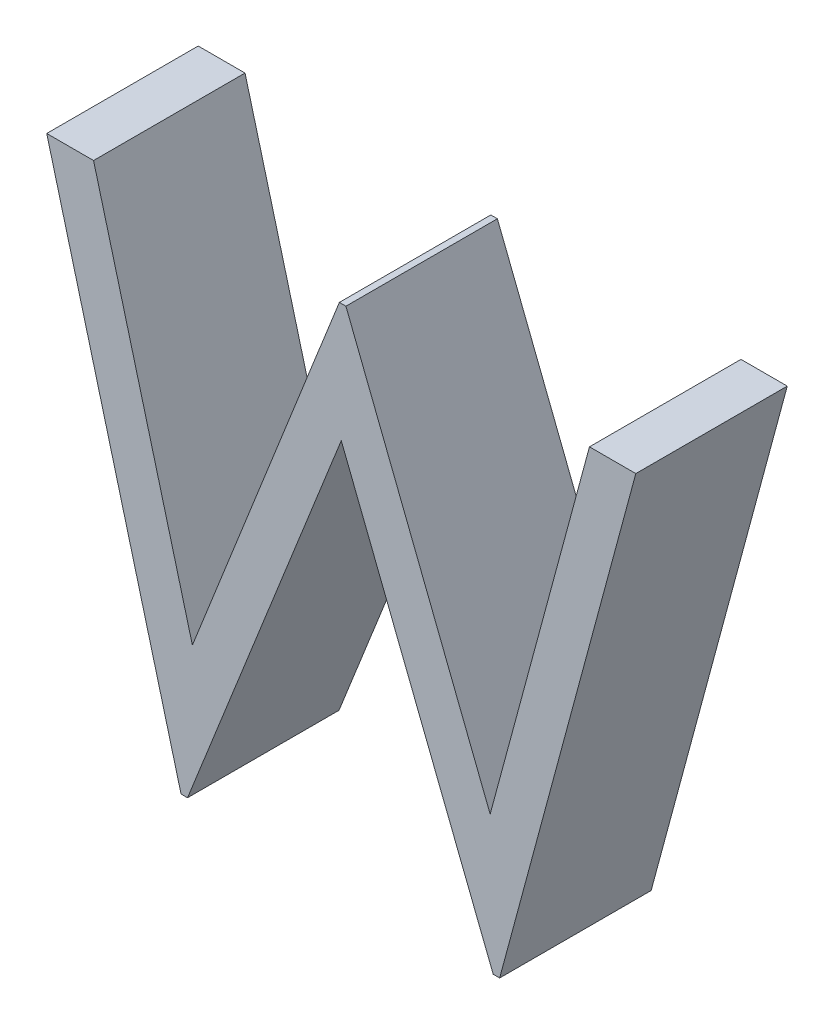
ISO-10303-21;
HEADER;
FILE_DESCRIPTION(('STEP AP214'),'2;1');
FILE_NAME('part.step','',(''),(''),'','','');
FILE_SCHEMA(('AUTOMOTIVE_DESIGN { 1 0 10303 214 1 1 1 1 }'));
ENDSEC;
DATA;
#1=APPLICATION_CONTEXT('core data for automotive mechanical design processes');
#2=APPLICATION_PROTOCOL_DEFINITION('international standard','automotive_design',2000,#1);
#3=PRODUCT_CONTEXT('',#1,'mechanical');
#4=PRODUCT('Part','Part','',(#3));
#5=PRODUCT_RELATED_PRODUCT_CATEGORY('part','',(#4));
#6=PRODUCT_DEFINITION_FORMATION('','',#4);
#7=PRODUCT_DEFINITION_CONTEXT('part definition',#1,'design');
#8=PRODUCT_DEFINITION('design','',#6,#7);
#9=PRODUCT_DEFINITION_SHAPE('','',#8);
#10=(LENGTH_UNIT() NAMED_UNIT(*) SI_UNIT(.MILLI.,.METRE.));
#11=(NAMED_UNIT(*) PLANE_ANGLE_UNIT() SI_UNIT($,.RADIAN.));
#12=(NAMED_UNIT(*) SI_UNIT($,.STERADIAN.) SOLID_ANGLE_UNIT());
#13=UNCERTAINTY_MEASURE_WITH_UNIT(LENGTH_MEASURE(1.E-05),#10,'distance_accuracy_value','');
#14=(GEOMETRIC_REPRESENTATION_CONTEXT(3) GLOBAL_UNCERTAINTY_ASSIGNED_CONTEXT((#13)) GLOBAL_UNIT_ASSIGNED_CONTEXT((#10,
#11,#12)) REPRESENTATION_CONTEXT('',''));
#15=CARTESIAN_POINT('',(0.,0.,0.));
#16=DIRECTION('',(0.,0.,1.));
#17=DIRECTION('',(1.,0.,0.));
#18=AXIS2_PLACEMENT_3D('',#15,#16,#17);
#19=CARTESIAN_POINT('',(-54.4228499412542,-22.8701190762308,1.5));
#20=DIRECTION('',(-0.966388993927676,-0.257084251589734,0.));
#21=DIRECTION('',(0.257084251589735,-0.966388993927676,0.));
#22=AXIS2_PLACEMENT_3D('',#19,#20,#21);
#23=PLANE('',#22);
#24=DIRECTION('',(-0.257084251589734,0.966388993927676,0.));
#25=VECTOR('',#24,1.);
#26=CARTESIAN_POINT('',(-54.4228499412542,-22.8701190762308,0.));
#27=LINE('',#26,#25);
#28=CARTESIAN_POINT('',(-54.4228499412542,-22.8701190762308,0.));
#29=VERTEX_POINT('',#28);
#30=CARTESIAN_POINT('',(-55.7529781463824,-17.8701190762308,0.));
#31=VERTEX_POINT('',#30);
#32=EDGE_CURVE('E160',#29,#31,#27,.T.);
#33=ORIENTED_EDGE('',*,*,#32,.F.);
#34=DIRECTION('',(0.,0.,-1.));
#35=VECTOR('',#34,1.);
#36=CARTESIAN_POINT('',(-54.4228499412542,-22.8701190762308,1.5));
#37=LINE('',#36,#35);
#38=CARTESIAN_POINT('',(-54.4228499412542,-22.8701190762308,1.5));
#39=VERTEX_POINT('',#38);
#40=EDGE_CURVE('E11',#39,#29,#37,.T.);
#41=ORIENTED_EDGE('',*,*,#40,.F.);
#42=DIRECTION('',(-0.257084251589734,0.966388993927676,0.));
#43=VECTOR('',#42,1.);
#44=CARTESIAN_POINT('',(-54.4228499412542,-22.8701190762308,1.5));
#45=LINE('',#44,#43);
#46=CARTESIAN_POINT('',(-55.7529781463824,-17.8701190762308,1.5));
#47=VERTEX_POINT('',#46);
#48=EDGE_CURVE('E195',#39,#47,#45,.T.);
#49=ORIENTED_EDGE('',*,*,#48,.T.);
#50=DIRECTION('',(0.,0.,-1.));
#51=VECTOR('',#50,1.);
#52=CARTESIAN_POINT('',(-55.7529781463824,-17.8701190762308,1.5));
#53=LINE('',#52,#51);
#54=EDGE_CURVE('E36',#47,#31,#53,.T.);
#55=ORIENTED_EDGE('',*,*,#54,.T.);
#56=EDGE_LOOP('',(#33,#41,#49,#55));
#57=FACE_BOUND('',#56,.T.);
#58=ADVANCED_FACE('F33',(#57),#23,.T.);
#59=CARTESIAN_POINT('',(-54.3587473771516,-22.8701190762308,1.5));
#60=DIRECTION('',(0.,-1.,0.));
#61=DIRECTION('',(0.,0.,-1.));
#62=AXIS2_PLACEMENT_3D('',#59,#60,#61);
#63=PLANE('',#62);
#64=DIRECTION('',(-1.,0.,0.));
#65=VECTOR('',#64,1.);
#66=CARTESIAN_POINT('',(-54.3587473771516,-22.8701190762308,0.));
#67=LINE('',#66,#65);
#68=CARTESIAN_POINT('',(-54.3587473771516,-22.8701190762308,0.));
#69=VERTEX_POINT('',#68);
#70=EDGE_CURVE('E193',#69,#29,#67,.T.);
#71=ORIENTED_EDGE('',*,*,#70,.F.);
#72=DIRECTION('',(0.,0.,-1.));
#73=VECTOR('',#72,1.);
#74=CARTESIAN_POINT('',(-54.3587473771516,-22.8701190762308,1.5));
#75=LINE('',#74,#73);
#76=CARTESIAN_POINT('',(-54.3587473771516,-22.8701190762308,1.5));
#77=VERTEX_POINT('',#76);
#78=EDGE_CURVE('E42',#77,#69,#75,.T.);
#79=ORIENTED_EDGE('',*,*,#78,.F.);
#80=DIRECTION('',(-1.,0.,0.));
#81=VECTOR('',#80,1.);
#82=CARTESIAN_POINT('',(-54.3587473771516,-22.8701190762308,1.5));
#83=LINE('',#82,#81);
#84=EDGE_CURVE('E150',#77,#39,#83,.T.);
#85=ORIENTED_EDGE('',*,*,#84,.T.);
#86=ORIENTED_EDGE('',*,*,#40,.T.);
#87=EDGE_LOOP('',(#71,#79,#85,#86));
#88=FACE_BOUND('',#87,.T.);
#89=ADVANCED_FACE('F217',(#88),#63,.T.);
#90=CARTESIAN_POINT('',(-52.8363114797157,-19.0460004864872,1.5));
#91=DIRECTION('',(0.929079621725965,-0.369879786543599,0.));
#92=DIRECTION('',(0.369879786543599,0.929079621725965,0.));
#93=AXIS2_PLACEMENT_3D('',#90,#91,#92);
#94=PLANE('',#93);
#95=DIRECTION('',(-0.369879786543599,-0.929079621725965,0.));
#96=VECTOR('',#95,1.);
#97=CARTESIAN_POINT('',(-52.8363114797157,-19.0460004864872,0.));
#98=LINE('',#97,#96);
#99=CARTESIAN_POINT('',(-52.8363114797157,-19.0460004864872,0.));
#100=VERTEX_POINT('',#99);
#101=EDGE_CURVE('E137',#100,#69,#98,.T.);
#102=ORIENTED_EDGE('',*,*,#101,.F.);
#103=DIRECTION('',(0.,0.,-1.));
#104=VECTOR('',#103,1.);
#105=CARTESIAN_POINT('',(-52.8363114797157,-19.0460004864872,1.5));
#106=LINE('',#105,#104);
#107=CARTESIAN_POINT('',(-52.8363114797157,-19.0460004864872,1.5));
#108=VERTEX_POINT('',#107);
#109=EDGE_CURVE('E132',#108,#100,#106,.T.);
#110=ORIENTED_EDGE('',*,*,#109,.F.);
#111=DIRECTION('',(-0.369879786543599,-0.929079621725965,0.));
#112=VECTOR('',#111,1.);
#113=CARTESIAN_POINT('',(-52.8363114797157,-19.0460004864872,1.5));
#114=LINE('',#113,#112);
#115=EDGE_CURVE('E135',#108,#77,#114,.T.);
#116=ORIENTED_EDGE('',*,*,#115,.T.);
#117=ORIENTED_EDGE('',*,*,#78,.T.);
#118=EDGE_LOOP('',(#102,#110,#116,#117));
#119=FACE_BOUND('',#118,.T.);
#120=ADVANCED_FACE('F134',(#119),#94,.T.);
#121=CARTESIAN_POINT('',(-51.3319044284336,-22.8701190762308,1.5));
#122=DIRECTION('',(-0.930579564355999,-0.36608970813586,0.));
#123=DIRECTION('',(0.36608970813586,-0.930579564355999,0.));
#124=AXIS2_PLACEMENT_3D('',#121,#122,#123);
#125=PLANE('',#124);
#126=DIRECTION('',(-0.36608970813586,0.930579564355999,0.));
#127=VECTOR('',#126,1.);
#128=CARTESIAN_POINT('',(-51.3319044284336,-22.8701190762308,0.));
#129=LINE('',#128,#127);
#130=CARTESIAN_POINT('',(-51.3319044284336,-22.8701190762308,0.));
#131=VERTEX_POINT('',#130);
#132=EDGE_CURVE('E190',#131,#100,#129,.T.);
#133=ORIENTED_EDGE('',*,*,#132,.F.);
#134=DIRECTION('',(0.,0.,-1.));
#135=VECTOR('',#134,1.);
#136=CARTESIAN_POINT('',(-51.3319044284336,-22.8701190762308,1.5));
#137=LINE('',#136,#135);
#138=CARTESIAN_POINT('',(-51.3319044284336,-22.8701190762308,1.5));
#139=VERTEX_POINT('',#138);
#140=EDGE_CURVE('E142',#139,#131,#137,.T.);
#141=ORIENTED_EDGE('',*,*,#140,.F.);
#142=DIRECTION('',(-0.36608970813586,0.930579564355999,0.));
#143=VECTOR('',#142,1.);
#144=CARTESIAN_POINT('',(-51.3319044284336,-22.8701190762308,1.5));
#145=LINE('',#144,#143);
#146=EDGE_CURVE('E148',#139,#108,#145,.T.);
#147=ORIENTED_EDGE('',*,*,#146,.T.);
#148=ORIENTED_EDGE('',*,*,#109,.T.);
#149=EDGE_LOOP('',(#133,#141,#147,#148));
#150=FACE_BOUND('',#149,.T.);
#151=ADVANCED_FACE('F152',(#150),#125,.T.);
#152=CARTESIAN_POINT('',(-51.2678018643311,-22.8701190762308,1.5));
#153=DIRECTION('',(0.,-1.,0.));
#154=DIRECTION('',(0.,0.,-1.));
#155=AXIS2_PLACEMENT_3D('',#152,#153,#154);
#156=PLANE('',#155);
#157=DIRECTION('',(-1.,0.,0.));
#158=VECTOR('',#157,1.);
#159=CARTESIAN_POINT('',(-51.2678018643311,-22.8701190762308,0.));
#160=LINE('',#159,#158);
#161=CARTESIAN_POINT('',(-51.2678018643311,-22.8701190762308,0.));
#162=VERTEX_POINT('',#161);
#163=EDGE_CURVE('E187',#162,#131,#160,.T.);
#164=ORIENTED_EDGE('',*,*,#163,.F.);
#165=DIRECTION('',(0.,0.,-1.));
#166=VECTOR('',#165,1.);
#167=CARTESIAN_POINT('',(-51.2678018643311,-22.8701190762308,1.5));
#168=LINE('',#167,#166);
#169=CARTESIAN_POINT('',(-51.2678018643311,-22.8701190762308,1.5));
#170=VERTEX_POINT('',#169);
#171=EDGE_CURVE('E199',#170,#162,#168,.T.);
#172=ORIENTED_EDGE('',*,*,#171,.F.);
#173=DIRECTION('',(-1.,0.,0.));
#174=VECTOR('',#173,1.);
#175=CARTESIAN_POINT('',(-51.2678018643311,-22.8701190762308,1.5));
#176=LINE('',#175,#174);
#177=EDGE_CURVE('E153',#170,#139,#176,.T.);
#178=ORIENTED_EDGE('',*,*,#177,.T.);
#179=ORIENTED_EDGE('',*,*,#140,.T.);
#180=EDGE_LOOP('',(#164,#172,#178,#179));
#181=FACE_BOUND('',#180,.T.);
#182=ADVANCED_FACE('F230',(#181),#156,.T.);
#183=CARTESIAN_POINT('',(-49.919644813049,-17.8701190762308,1.5));
#184=DIRECTION('',(0.965518584404461,-0.260334137541748,0.));
#185=DIRECTION('',(0.260334137541748,0.965518584404461,0.));
#186=AXIS2_PLACEMENT_3D('',#183,#184,#185);
#187=PLANE('',#186);
#188=DIRECTION('',(-0.260334137541748,-0.965518584404461,0.));
#189=VECTOR('',#188,1.);
#190=CARTESIAN_POINT('',(-49.919644813049,-17.8701190762308,0.));
#191=LINE('',#190,#189);
#192=CARTESIAN_POINT('',(-49.919644813049,-17.8701190762308,0.));
#193=VERTEX_POINT('',#192);
#194=EDGE_CURVE('E184',#193,#162,#191,.T.);
#195=ORIENTED_EDGE('',*,*,#194,.F.);
#196=DIRECTION('',(0.,0.,-1.));
#197=VECTOR('',#196,1.);
#198=CARTESIAN_POINT('',(-49.919644813049,-17.8701190762308,1.5));
#199=LINE('',#198,#197);
#200=CARTESIAN_POINT('',(-49.919644813049,-17.8701190762308,1.5));
#201=VERTEX_POINT('',#200);
#202=EDGE_CURVE('E201',#201,#193,#199,.T.);
#203=ORIENTED_EDGE('',*,*,#202,.F.);
#204=DIRECTION('',(-0.260334137541748,-0.965518584404461,0.));
#205=VECTOR('',#204,1.);
#206=CARTESIAN_POINT('',(-49.919644813049,-17.8701190762308,1.5));
#207=LINE('',#206,#205);
#208=EDGE_CURVE('E155',#201,#170,#207,.T.);
#209=ORIENTED_EDGE('',*,*,#208,.T.);
#210=ORIENTED_EDGE('',*,*,#171,.T.);
#211=EDGE_LOOP('',(#195,#203,#209,#210));
#212=FACE_BOUND('',#211,.T.);
#213=ADVANCED_FACE('F233',(#212),#187,.T.);
#214=CARTESIAN_POINT('',(-50.378378787408,-17.8701190762308,1.5));
#215=DIRECTION('',(0.,1.,0.));
#216=DIRECTION('',(0.,0.,1.));
#217=AXIS2_PLACEMENT_3D('',#214,#215,#216);
#218=PLANE('',#217);
#219=DIRECTION('',(1.,0.,0.));
#220=VECTOR('',#219,1.);
#221=CARTESIAN_POINT('',(-50.378378787408,-17.8701190762308,0.));
#222=LINE('',#221,#220);
#223=CARTESIAN_POINT('',(-50.378378787408,-17.8701190762308,0.));
#224=VERTEX_POINT('',#223);
#225=EDGE_CURVE('E181',#224,#193,#222,.T.);
#226=ORIENTED_EDGE('',*,*,#225,.F.);
#227=DIRECTION('',(0.,0.,-1.));
#228=VECTOR('',#227,1.);
#229=CARTESIAN_POINT('',(-50.378378787408,-17.8701190762308,1.5));
#230=LINE('',#229,#228);
#231=CARTESIAN_POINT('',(-50.378378787408,-17.8701190762308,1.5));
#232=VERTEX_POINT('',#231);
#233=EDGE_CURVE('E203',#232,#224,#230,.T.);
#234=ORIENTED_EDGE('',*,*,#233,.F.);
#235=DIRECTION('',(1.,0.,0.));
#236=VECTOR('',#235,1.);
#237=CARTESIAN_POINT('',(-50.378378787408,-17.8701190762308,1.5));
#238=LINE('',#237,#236);
#239=EDGE_CURVE('E409',#232,#201,#238,.T.);
#240=ORIENTED_EDGE('',*,*,#239,.T.);
#241=ORIENTED_EDGE('',*,*,#202,.T.);
#242=EDGE_LOOP('',(#226,#234,#240,#241));
#243=FACE_BOUND('',#242,.T.);
#244=ADVANCED_FACE('F237',(#243),#218,.T.);
#245=CARTESIAN_POINT('',(-51.3619525053567,-21.5119459993077,1.5));
#246=DIRECTION('',(-0.965410371069075,0.260735144221625,0.));
#247=DIRECTION('',(-0.260735144221625,-0.965410371069075,0.));
#248=AXIS2_PLACEMENT_3D('',#245,#246,#247);
#249=PLANE('',#248);
#250=DIRECTION('',(0.260735144221625,0.965410371069074,0.));
#251=VECTOR('',#250,1.);
#252=CARTESIAN_POINT('',(-51.3619525053567,-21.5119459993077,0.));
#253=LINE('',#252,#251);
#254=CARTESIAN_POINT('',(-51.3619525053567,-21.5119459993077,0.));
#255=VERTEX_POINT('',#254);
#256=EDGE_CURVE('E178',#255,#224,#253,.T.);
#257=ORIENTED_EDGE('',*,*,#256,.F.);
#258=DIRECTION('',(0.,0.,-1.));
#259=VECTOR('',#258,1.);
#260=CARTESIAN_POINT('',(-51.3619525053567,-21.5119459993077,1.5));
#261=LINE('',#260,#259);
#262=CARTESIAN_POINT('',(-51.3619525053567,-21.5119459993077,1.5));
#263=VERTEX_POINT('',#262);
#264=EDGE_CURVE('E205',#263,#255,#261,.T.);
#265=ORIENTED_EDGE('',*,*,#264,.F.);
#266=DIRECTION('',(0.260735144221625,0.965410371069074,0.));
#267=VECTOR('',#266,1.);
#268=CARTESIAN_POINT('',(-51.3619525053567,-21.5119459993077,1.5));
#269=LINE('',#268,#267);
#270=EDGE_CURVE('E405',#263,#232,#269,.T.);
#271=ORIENTED_EDGE('',*,*,#270,.T.);
#272=ORIENTED_EDGE('',*,*,#233,.T.);
#273=EDGE_LOOP('',(#257,#265,#271,#272));
#274=FACE_BOUND('',#273,.T.);
#275=ADVANCED_FACE('F241',(#274),#249,.T.);
#276=CARTESIAN_POINT('',(-52.790237761767,-17.8701190762308,1.5));
#277=DIRECTION('',(0.93096295991701,0.365113636095065,0.));
#278=DIRECTION('',(-0.365113636095065,0.93096295991701,0.));
#279=AXIS2_PLACEMENT_3D('',#276,#277,#278);
#280=PLANE('',#279);
#281=DIRECTION('',(0.365113636095065,-0.93096295991701,0.));
#282=VECTOR('',#281,1.);
#283=CARTESIAN_POINT('',(-52.790237761767,-17.8701190762308,0.));
#284=LINE('',#283,#282);
#285=CARTESIAN_POINT('',(-52.790237761767,-17.8701190762308,0.));
#286=VERTEX_POINT('',#285);
#287=EDGE_CURVE('E175',#286,#255,#284,.T.);
#288=ORIENTED_EDGE('',*,*,#287,.F.);
#289=DIRECTION('',(0.,0.,-1.));
#290=VECTOR('',#289,1.);
#291=CARTESIAN_POINT('',(-52.790237761767,-17.8701190762308,1.5));
#292=LINE('',#291,#290);
#293=CARTESIAN_POINT('',(-52.790237761767,-17.8701190762308,1.5));
#294=VERTEX_POINT('',#293);
#295=EDGE_CURVE('E207',#294,#286,#292,.T.);
#296=ORIENTED_EDGE('',*,*,#295,.F.);
#297=DIRECTION('',(0.365113636095065,-0.93096295991701,0.));
#298=VECTOR('',#297,1.);
#299=CARTESIAN_POINT('',(-52.790237761767,-17.8701190762308,1.5));
#300=LINE('',#299,#298);
#301=EDGE_CURVE('E416',#294,#263,#300,.T.);
#302=ORIENTED_EDGE('',*,*,#301,.T.);
#303=ORIENTED_EDGE('',*,*,#264,.T.);
#304=EDGE_LOOP('',(#288,#296,#302,#303));
#305=FACE_BOUND('',#304,.T.);
#306=ADVANCED_FACE('F245',(#305),#280,.T.);
#307=CARTESIAN_POINT('',(-52.8553419284336,-17.8701190762308,1.5));
#308=DIRECTION('',(0.,1.,0.));
#309=DIRECTION('',(0.,0.,1.));
#310=AXIS2_PLACEMENT_3D('',#307,#308,#309);
#311=PLANE('',#310);
#312=DIRECTION('',(1.,0.,0.));
#313=VECTOR('',#312,1.);
#314=CARTESIAN_POINT('',(-52.8553419284336,-17.8701190762308,0.));
#315=LINE('',#314,#313);
#316=CARTESIAN_POINT('',(-52.8553419284336,-17.8701190762308,0.));
#317=VERTEX_POINT('',#316);
#318=EDGE_CURVE('E172',#317,#286,#315,.T.);
#319=ORIENTED_EDGE('',*,*,#318,.F.);
#320=DIRECTION('',(0.,0.,-1.));
#321=VECTOR('',#320,1.);
#322=CARTESIAN_POINT('',(-52.8553419284336,-17.8701190762308,1.5));
#323=LINE('',#322,#321);
#324=CARTESIAN_POINT('',(-52.8553419284336,-17.8701190762308,1.5));
#325=VERTEX_POINT('',#324);
#326=EDGE_CURVE('E209',#325,#317,#323,.T.);
#327=ORIENTED_EDGE('',*,*,#326,.F.);
#328=DIRECTION('',(1.,0.,0.));
#329=VECTOR('',#328,1.);
#330=CARTESIAN_POINT('',(-52.8553419284336,-17.8701190762308,1.5));
#331=LINE('',#330,#329);
#332=EDGE_CURVE('E398',#325,#294,#331,.T.);
#333=ORIENTED_EDGE('',*,*,#332,.T.);
#334=ORIENTED_EDGE('',*,*,#295,.T.);
#335=EDGE_LOOP('',(#319,#327,#333,#334));
#336=FACE_BOUND('',#335,.T.);
#337=ADVANCED_FACE('F249',(#336),#311,.T.);
#338=CARTESIAN_POINT('',(-54.3106704540747,-21.5369860634103,1.5));
#339=DIRECTION('',(-0.929471367358842,0.368894262980714,0.));
#340=DIRECTION('',(-0.368894262980714,-0.929471367358842,0.));
#341=AXIS2_PLACEMENT_3D('',#338,#339,#340);
#342=PLANE('',#341);
#343=DIRECTION('',(0.368894262980714,0.929471367358842,0.));
#344=VECTOR('',#343,1.);
#345=CARTESIAN_POINT('',(-54.3106704540747,-21.5369860634103,0.));
#346=LINE('',#345,#344);
#347=CARTESIAN_POINT('',(-54.3106704540747,-21.5369860634103,0.));
#348=VERTEX_POINT('',#347);
#349=EDGE_CURVE('E169',#348,#317,#346,.T.);
#350=ORIENTED_EDGE('',*,*,#349,.F.);
#351=DIRECTION('',(0.,0.,-1.));
#352=VECTOR('',#351,1.);
#353=CARTESIAN_POINT('',(-54.3106704540747,-21.5369860634103,1.5));
#354=LINE('',#353,#352);
#355=CARTESIAN_POINT('',(-54.3106704540747,-21.5369860634103,1.5));
#356=VERTEX_POINT('',#355);
#357=EDGE_CURVE('E211',#356,#348,#354,.T.);
#358=ORIENTED_EDGE('',*,*,#357,.F.);
#359=DIRECTION('',(0.368894262980714,0.929471367358842,0.));
#360=VECTOR('',#359,1.);
#361=CARTESIAN_POINT('',(-54.3106704540747,-21.5369860634103,1.5));
#362=LINE('',#361,#360);
#363=EDGE_CURVE('E394',#356,#325,#362,.T.);
#364=ORIENTED_EDGE('',*,*,#363,.T.);
#365=ORIENTED_EDGE('',*,*,#326,.T.);
#366=EDGE_LOOP('',(#350,#358,#364,#365));
#367=FACE_BOUND('',#366,.T.);
#368=ADVANCED_FACE('F253',(#367),#342,.T.);
#369=CARTESIAN_POINT('',(-55.2892361592029,-17.8701190762308,1.5));
#370=DIRECTION('',(0.966186739358345,0.257843333611883,0.));
#371=DIRECTION('',(-0.257843333611883,0.966186739358345,0.));
#372=AXIS2_PLACEMENT_3D('',#369,#370,#371);
#373=PLANE('',#372);
#374=DIRECTION('',(0.257843333611883,-0.966186739358345,0.));
#375=VECTOR('',#374,1.);
#376=CARTESIAN_POINT('',(-55.2892361592029,-17.8701190762308,0.));
#377=LINE('',#376,#375);
#378=CARTESIAN_POINT('',(-55.2892361592029,-17.8701190762308,0.));
#379=VERTEX_POINT('',#378);
#380=EDGE_CURVE('E166',#379,#348,#377,.T.);
#381=ORIENTED_EDGE('',*,*,#380,.F.);
#382=DIRECTION('',(0.,0.,-1.));
#383=VECTOR('',#382,1.);
#384=CARTESIAN_POINT('',(-55.2892361592029,-17.8701190762308,1.5));
#385=LINE('',#384,#383);
#386=CARTESIAN_POINT('',(-55.2892361592029,-17.8701190762308,1.5));
#387=VERTEX_POINT('',#386);
#388=EDGE_CURVE('E212',#387,#379,#385,.T.);
#389=ORIENTED_EDGE('',*,*,#388,.F.);
#390=DIRECTION('',(0.257843333611883,-0.966186739358345,0.));
#391=VECTOR('',#390,1.);
#392=CARTESIAN_POINT('',(-55.2892361592029,-17.8701190762308,1.5));
#393=LINE('',#392,#391);
#394=EDGE_CURVE('E420',#387,#356,#393,.T.);
#395=ORIENTED_EDGE('',*,*,#394,.T.);
#396=ORIENTED_EDGE('',*,*,#357,.T.);
#397=EDGE_LOOP('',(#381,#389,#395,#396));
#398=FACE_BOUND('',#397,.T.);
#399=ADVANCED_FACE('F257',(#398),#373,.T.);
#400=CARTESIAN_POINT('',(-55.7529781463824,-17.8701190762308,1.5));
#401=DIRECTION('',(0.,1.,0.));
#402=DIRECTION('',(0.,0.,1.));
#403=AXIS2_PLACEMENT_3D('',#400,#401,#402);
#404=PLANE('',#403);
#405=DIRECTION('',(1.,0.,0.));
#406=VECTOR('',#405,1.);
#407=CARTESIAN_POINT('',(-55.7529781463824,-17.8701190762308,0.));
#408=LINE('',#407,#406);
#409=EDGE_CURVE('E163',#31,#379,#408,.T.);
#410=ORIENTED_EDGE('',*,*,#409,.F.);
#411=ORIENTED_EDGE('',*,*,#54,.F.);
#412=DIRECTION('',(1.,0.,0.));
#413=VECTOR('',#412,1.);
#414=CARTESIAN_POINT('',(-55.7529781463824,-17.8701190762308,1.5));
#415=LINE('',#414,#413);
#416=EDGE_CURVE('E422',#47,#387,#415,.T.);
#417=ORIENTED_EDGE('',*,*,#416,.T.);
#418=ORIENTED_EDGE('',*,*,#388,.T.);
#419=EDGE_LOOP('',(#410,#411,#417,#418));
#420=FACE_BOUND('',#419,.T.);
#421=ADVANCED_FACE('F214',(#420),#404,.T.);
#422=CARTESIAN_POINT('',(0.,0.,1.5));
#423=DIRECTION('',(0.,0.,-1.));
#424=DIRECTION('',(-1.,0.,0.));
#425=AXIS2_PLACEMENT_3D('',#422,#423,#424);
#426=PLANE('',#425);
#427=ORIENTED_EDGE('',*,*,#48,.F.);
#428=ORIENTED_EDGE('',*,*,#84,.F.);
#429=ORIENTED_EDGE('',*,*,#115,.F.);
#430=ORIENTED_EDGE('',*,*,#146,.F.);
#431=ORIENTED_EDGE('',*,*,#177,.F.);
#432=ORIENTED_EDGE('',*,*,#208,.F.);
#433=ORIENTED_EDGE('',*,*,#239,.F.);
#434=ORIENTED_EDGE('',*,*,#270,.F.);
#435=ORIENTED_EDGE('',*,*,#301,.F.);
#436=ORIENTED_EDGE('',*,*,#332,.F.);
#437=ORIENTED_EDGE('',*,*,#363,.F.);
#438=ORIENTED_EDGE('',*,*,#394,.F.);
#439=ORIENTED_EDGE('',*,*,#416,.F.);
#440=EDGE_LOOP('',(#427,#428,#429,#430,#431,#432,#433,#434,#435,#436,#437,#438,#439));
#441=FACE_BOUND('',#440,.T.);
#442=ADVANCED_FACE('F146',(#441),#426,.F.);
#443=CARTESIAN_POINT('',(0.,0.,0.));
#444=DIRECTION('',(0.,0.,-1.));
#445=DIRECTION('',(-1.,0.,0.));
#446=AXIS2_PLACEMENT_3D('',#443,#444,#445);
#447=PLANE('',#446);
#448=ORIENTED_EDGE('',*,*,#32,.T.);
#449=ORIENTED_EDGE('',*,*,#409,.T.);
#450=ORIENTED_EDGE('',*,*,#380,.T.);
#451=ORIENTED_EDGE('',*,*,#349,.T.);
#452=ORIENTED_EDGE('',*,*,#318,.T.);
#453=ORIENTED_EDGE('',*,*,#287,.T.);
#454=ORIENTED_EDGE('',*,*,#256,.T.);
#455=ORIENTED_EDGE('',*,*,#225,.T.);
#456=ORIENTED_EDGE('',*,*,#194,.T.);
#457=ORIENTED_EDGE('',*,*,#163,.T.);
#458=ORIENTED_EDGE('',*,*,#132,.T.);
#459=ORIENTED_EDGE('',*,*,#101,.T.);
#460=ORIENTED_EDGE('',*,*,#70,.T.);
#461=EDGE_LOOP('',(#448,#449,#450,#451,#452,#453,#454,#455,#456,#457,#458,#459,#460));
#462=FACE_BOUND('',#461,.T.);
#463=ADVANCED_FACE('F216',(#462),#447,.T.);
#464=CLOSED_SHELL('',(#58,#89,#120,#151,#182,#213,#244,#275,#306,#337,#368,#399,#421,#442,#463));
#465=MANIFOLD_SOLID_BREP('B2',#464);
#466=ADVANCED_BREP_SHAPE_REPRESENTATION('',(#18,#465),#14);
#467=SHAPE_DEFINITION_REPRESENTATION(#9,#466);
ENDSEC;
END-ISO-10303-21;
